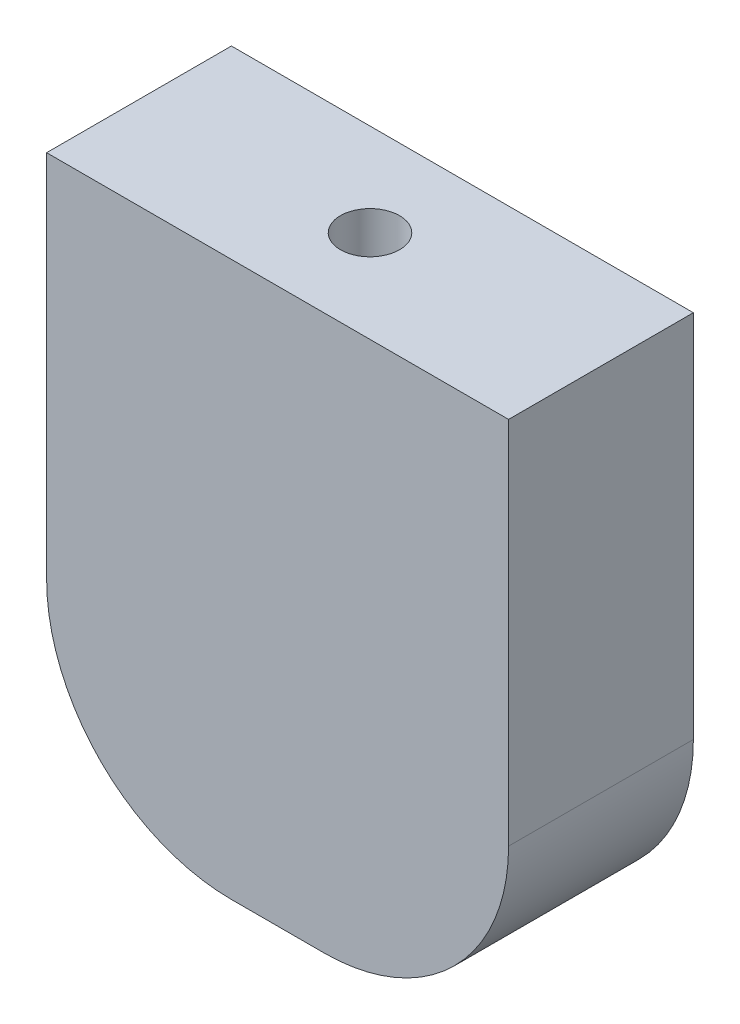
ISO-10303-21;
HEADER;
FILE_DESCRIPTION(('STEP AP214'),'2;1');
FILE_NAME('part.step','',(''),(''),'','','');
FILE_SCHEMA(('AUTOMOTIVE_DESIGN { 1 0 10303 214 1 1 1 1 }'));
ENDSEC;
DATA;
#1=APPLICATION_CONTEXT('core data for automotive mechanical design processes');
#2=APPLICATION_PROTOCOL_DEFINITION('international standard','automotive_design',2000,#1);
#3=PRODUCT_CONTEXT('',#1,'mechanical');
#4=PRODUCT('Part','Part','',(#3));
#5=PRODUCT_RELATED_PRODUCT_CATEGORY('part','',(#4));
#6=PRODUCT_DEFINITION_FORMATION('','',#4);
#7=PRODUCT_DEFINITION_CONTEXT('part definition',#1,'design');
#8=PRODUCT_DEFINITION('design','',#6,#7);
#9=PRODUCT_DEFINITION_SHAPE('','',#8);
#10=(LENGTH_UNIT() NAMED_UNIT(*) SI_UNIT(.MILLI.,.METRE.));
#11=(NAMED_UNIT(*) PLANE_ANGLE_UNIT() SI_UNIT($,.RADIAN.));
#12=(NAMED_UNIT(*) SI_UNIT($,.STERADIAN.) SOLID_ANGLE_UNIT());
#13=UNCERTAINTY_MEASURE_WITH_UNIT(LENGTH_MEASURE(1.E-05),#10,'distance_accuracy_value','');
#14=(GEOMETRIC_REPRESENTATION_CONTEXT(3) GLOBAL_UNCERTAINTY_ASSIGNED_CONTEXT((#13)) GLOBAL_UNIT_ASSIGNED_CONTEXT((#10,
#11,#12)) REPRESENTATION_CONTEXT('',''));
#15=CARTESIAN_POINT('',(0.,0.,0.));
#16=DIRECTION('',(0.,0.,1.));
#17=DIRECTION('',(1.,0.,0.));
#18=AXIS2_PLACEMENT_3D('',#15,#16,#17);
#19=CARTESIAN_POINT('',(6.35,73.6600000000001,6.35));
#20=DIRECTION('',(1.,0.,0.));
#21=DIRECTION('',(0.,1.,0.));
#22=AXIS2_PLACEMENT_3D('',#19,#20,#21);
#23=PLANE('',#22);
#24=DIRECTION('',(0.,-1.,0.));
#25=VECTOR('',#24,1.);
#26=CARTESIAN_POINT('',(6.35,73.6600000000001,-6.35));
#27=LINE('',#26,#25);
#28=CARTESIAN_POINT('',(6.35,73.6600000000001,-6.35));
#29=VERTEX_POINT('',#28);
#30=CARTESIAN_POINT('',(6.35,48.2600000000001,-6.35));
#31=VERTEX_POINT('',#30);
#32=EDGE_CURVE('E112',#29,#31,#27,.T.);
#33=ORIENTED_EDGE('',*,*,#32,.T.);
#34=DIRECTION('',(0.,0.,-1.));
#35=VECTOR('',#34,1.);
#36=CARTESIAN_POINT('',(6.35,48.2600000000001,6.35));
#37=LINE('',#36,#35);
#38=CARTESIAN_POINT('',(6.35,48.2600000000001,6.35));
#39=VERTEX_POINT('',#38);
#40=EDGE_CURVE('E11',#31,#39,#37,.F.);
#41=ORIENTED_EDGE('',*,*,#40,.T.);
#42=DIRECTION('',(0.,-1.,0.));
#43=VECTOR('',#42,1.);
#44=CARTESIAN_POINT('',(6.35,73.6600000000001,6.35));
#45=LINE('',#44,#43);
#46=CARTESIAN_POINT('',(6.35,73.6600000000001,6.35));
#47=VERTEX_POINT('',#46);
#48=EDGE_CURVE('E119',#47,#39,#45,.T.);
#49=ORIENTED_EDGE('',*,*,#48,.F.);
#50=DIRECTION('',(0.,0.,-1.));
#51=VECTOR('',#50,1.);
#52=CARTESIAN_POINT('',(6.35,73.6600000000001,6.35));
#53=LINE('',#52,#51);
#54=EDGE_CURVE('E104',#47,#29,#53,.T.);
#55=ORIENTED_EDGE('',*,*,#54,.T.);
#56=EDGE_LOOP('',(#33,#41,#49,#55));
#57=FACE_BOUND('',#56,.T.);
#58=ADVANCED_FACE('F30',(#57),#23,.F.);
#59=CARTESIAN_POINT('',(6.35,35.5600000000001,6.35));
#60=DIRECTION('',(0.,1.,0.));
#61=DIRECTION('',(0.,0.,1.));
#62=AXIS2_PLACEMENT_3D('',#59,#60,#61);
#63=PLANE('',#62);
#64=DIRECTION('',(1.,0.,0.));
#65=VECTOR('',#64,1.);
#66=CARTESIAN_POINT('',(6.35,35.5600000000001,-6.35));
#67=LINE('',#66,#65);
#68=CARTESIAN_POINT('',(19.05,35.5600000000001,-6.35));
#69=VERTEX_POINT('',#68);
#70=CARTESIAN_POINT('',(25.4,35.5600000000001,-6.35));
#71=VERTEX_POINT('',#70);
#72=EDGE_CURVE('E114',#69,#71,#67,.T.);
#73=ORIENTED_EDGE('',*,*,#72,.T.);
#74=DIRECTION('',(0.,0.,-1.));
#75=VECTOR('',#74,1.);
#76=CARTESIAN_POINT('',(25.4,35.5600000000001,6.35));
#77=LINE('',#76,#75);
#78=CARTESIAN_POINT('',(25.4,35.5600000000001,6.35));
#79=VERTEX_POINT('',#78);
#80=EDGE_CURVE('E51',#71,#79,#77,.F.);
#81=ORIENTED_EDGE('',*,*,#80,.T.);
#82=DIRECTION('',(1.,0.,0.));
#83=VECTOR('',#82,1.);
#84=CARTESIAN_POINT('',(6.35,35.5600000000001,6.35));
#85=LINE('',#84,#83);
#86=CARTESIAN_POINT('',(19.05,35.5600000000001,6.35));
#87=VERTEX_POINT('',#86);
#88=EDGE_CURVE('E94',#87,#79,#85,.T.);
#89=ORIENTED_EDGE('',*,*,#88,.F.);
#90=DIRECTION('',(0.,0.,-1.));
#91=VECTOR('',#90,1.);
#92=CARTESIAN_POINT('',(19.05,35.5600000000001,6.35));
#93=LINE('',#92,#91);
#94=EDGE_CURVE('E126',#87,#69,#93,.T.);
#95=ORIENTED_EDGE('',*,*,#94,.T.);
#96=EDGE_LOOP('',(#73,#81,#89,#95));
#97=FACE_BOUND('',#96,.T.);
#98=ADVANCED_FACE('F134',(#97),#63,.F.);
#99=CARTESIAN_POINT('',(38.1,73.6600000000001,6.35));
#100=DIRECTION('',(-1.,0.,0.));
#101=DIRECTION('',(0.,0.,1.));
#102=AXIS2_PLACEMENT_3D('',#99,#100,#101);
#103=PLANE('',#102);
#104=DIRECTION('',(0.,1.,0.));
#105=VECTOR('',#104,1.);
#106=CARTESIAN_POINT('',(38.1,73.6600000000001,6.35));
#107=LINE('',#106,#105);
#108=CARTESIAN_POINT('',(38.1,48.2600000000001,6.35));
#109=VERTEX_POINT('',#108);
#110=CARTESIAN_POINT('',(38.1,73.6600000000001,6.35));
#111=VERTEX_POINT('',#110);
#112=EDGE_CURVE('E84',#109,#111,#107,.T.);
#113=ORIENTED_EDGE('',*,*,#112,.F.);
#114=DIRECTION('',(0.,0.,-1.));
#115=VECTOR('',#114,1.);
#116=CARTESIAN_POINT('',(38.1,48.2600000000001,6.35));
#117=LINE('',#116,#115);
#118=CARTESIAN_POINT('',(38.1,48.2600000000001,-6.35));
#119=VERTEX_POINT('',#118);
#120=EDGE_CURVE('E103',#109,#119,#117,.T.);
#121=ORIENTED_EDGE('',*,*,#120,.T.);
#122=DIRECTION('',(0.,1.,0.));
#123=VECTOR('',#122,1.);
#124=CARTESIAN_POINT('',(38.1,73.6600000000001,-6.35));
#125=LINE('',#124,#123);
#126=CARTESIAN_POINT('',(38.1,73.6600000000001,-6.35));
#127=VERTEX_POINT('',#126);
#128=EDGE_CURVE('E100',#119,#127,#125,.T.);
#129=ORIENTED_EDGE('',*,*,#128,.T.);
#130=DIRECTION('',(0.,0.,-1.));
#131=VECTOR('',#130,1.);
#132=CARTESIAN_POINT('',(38.1,73.6600000000001,6.35));
#133=LINE('',#132,#131);
#134=EDGE_CURVE('E97',#111,#127,#133,.T.);
#135=ORIENTED_EDGE('',*,*,#134,.F.);
#136=EDGE_LOOP('',(#113,#121,#129,#135));
#137=FACE_BOUND('',#136,.T.);
#138=ADVANCED_FACE('F98',(#137),#103,.F.);
#139=CARTESIAN_POINT('',(6.35,73.6600000000001,6.35));
#140=DIRECTION('',(0.,-1.,0.));
#141=DIRECTION('',(0.,0.,-1.));
#142=AXIS2_PLACEMENT_3D('',#139,#140,#141);
#143=PLANE('',#142);
#144=CARTESIAN_POINT('',(22.225,73.6600000000001,0.));
#145=DIRECTION('',(0.,1.,0.));
#146=DIRECTION('',(0.,0.,1.));
#147=AXIS2_PLACEMENT_3D('',#144,#145,#146);
#148=CIRCLE('',#147,2.032);
#149=CARTESIAN_POINT('',(22.225,73.6600000000001,2.032));
#150=VERTEX_POINT('',#149);
#151=EDGE_CURVE('E141',#150,#150,#148,.T.);
#152=ORIENTED_EDGE('',*,*,#151,.F.);
#153=EDGE_LOOP('',(#152));
#154=FACE_BOUND('',#153,.T.);
#155=DIRECTION('',(-1.,0.,0.));
#156=VECTOR('',#155,1.);
#157=CARTESIAN_POINT('',(6.35,73.6600000000001,-6.35));
#158=LINE('',#157,#156);
#159=EDGE_CURVE('E118',#127,#29,#158,.T.);
#160=ORIENTED_EDGE('',*,*,#159,.T.);
#161=ORIENTED_EDGE('',*,*,#54,.F.);
#162=DIRECTION('',(-1.,0.,0.));
#163=VECTOR('',#162,1.);
#164=CARTESIAN_POINT('',(6.35,73.6600000000001,6.35));
#165=LINE('',#164,#163);
#166=EDGE_CURVE('E88',#111,#47,#165,.T.);
#167=ORIENTED_EDGE('',*,*,#166,.F.);
#168=ORIENTED_EDGE('',*,*,#134,.T.);
#169=EDGE_LOOP('',(#160,#161,#167,#168));
#170=FACE_BOUND('',#169,.T.);
#171=ADVANCED_FACE('F106',(#154,#170),#143,.F.);
#172=CARTESIAN_POINT('',(6.35,35.5600000000001,6.35));
#173=DIRECTION('',(0.,0.,1.));
#174=DIRECTION('',(1.,0.,0.));
#175=AXIS2_PLACEMENT_3D('',#172,#173,#174);
#176=PLANE('',#175);
#177=ORIENTED_EDGE('',*,*,#88,.T.);
#178=CARTESIAN_POINT('',(25.4,48.2600000000001,6.35));
#179=DIRECTION('',(0.,0.,1.));
#180=DIRECTION('',(1.,0.,0.));
#181=AXIS2_PLACEMENT_3D('',#178,#179,#180);
#182=CIRCLE('',#181,12.7);
#183=EDGE_CURVE('E38',#79,#109,#182,.T.);
#184=ORIENTED_EDGE('',*,*,#183,.T.);
#185=ORIENTED_EDGE('',*,*,#112,.T.);
#186=ORIENTED_EDGE('',*,*,#166,.T.);
#187=ORIENTED_EDGE('',*,*,#48,.T.);
#188=CARTESIAN_POINT('',(19.05,48.2600000000001,6.35));
#189=DIRECTION('',(0.,0.,1.));
#190=DIRECTION('',(1.,0.,0.));
#191=AXIS2_PLACEMENT_3D('',#188,#189,#190);
#192=CIRCLE('',#191,12.7);
#193=EDGE_CURVE('E130',#39,#87,#192,.T.);
#194=ORIENTED_EDGE('',*,*,#193,.T.);
#195=EDGE_LOOP('',(#177,#184,#185,#186,#187,#194));
#196=FACE_BOUND('',#195,.T.);
#197=ADVANCED_FACE('F86',(#196),#176,.T.);
#198=CARTESIAN_POINT('',(6.35,35.5600000000001,-6.35));
#199=DIRECTION('',(0.,0.,1.));
#200=DIRECTION('',(1.,0.,0.));
#201=AXIS2_PLACEMENT_3D('',#198,#199,#200);
#202=PLANE('',#201);
#203=ORIENTED_EDGE('',*,*,#128,.F.);
#204=CARTESIAN_POINT('',(25.4,48.2600000000001,-6.35));
#205=DIRECTION('',(0.,0.,1.));
#206=DIRECTION('',(1.,0.,0.));
#207=AXIS2_PLACEMENT_3D('',#204,#205,#206);
#208=CIRCLE('',#207,12.7);
#209=EDGE_CURVE('E124',#119,#71,#208,.F.);
#210=ORIENTED_EDGE('',*,*,#209,.T.);
#211=ORIENTED_EDGE('',*,*,#72,.F.);
#212=CARTESIAN_POINT('',(19.05,48.2600000000001,-6.35));
#213=DIRECTION('',(0.,0.,1.));
#214=DIRECTION('',(1.,0.,0.));
#215=AXIS2_PLACEMENT_3D('',#212,#213,#214);
#216=CIRCLE('',#215,12.7);
#217=EDGE_CURVE('E122',#69,#31,#216,.F.);
#218=ORIENTED_EDGE('',*,*,#217,.T.);
#219=ORIENTED_EDGE('',*,*,#32,.F.);
#220=ORIENTED_EDGE('',*,*,#159,.F.);
#221=EDGE_LOOP('',(#203,#210,#211,#218,#219,#220));
#222=FACE_BOUND('',#221,.T.);
#223=ADVANCED_FACE('F138',(#222),#202,.F.);
#224=CARTESIAN_POINT('',(25.4,48.2600000000001,6.35));
#225=DIRECTION('',(0.,0.,-1.));
#226=DIRECTION('',(-1.,0.,0.));
#227=AXIS2_PLACEMENT_3D('',#224,#225,#226);
#228=CYLINDRICAL_SURFACE('',#227,12.7);
#229=ORIENTED_EDGE('',*,*,#183,.F.);
#230=ORIENTED_EDGE('',*,*,#80,.F.);
#231=ORIENTED_EDGE('',*,*,#209,.F.);
#232=ORIENTED_EDGE('',*,*,#120,.F.);
#233=EDGE_LOOP('',(#229,#230,#231,#232));
#234=FACE_BOUND('',#233,.T.);
#235=ADVANCED_FACE('F170',(#234),#228,.T.);
#236=CARTESIAN_POINT('',(19.05,48.2600000000001,6.35));
#237=DIRECTION('',(0.,0.,-1.));
#238=DIRECTION('',(-1.,0.,0.));
#239=AXIS2_PLACEMENT_3D('',#236,#237,#238);
#240=CYLINDRICAL_SURFACE('',#239,12.7);
#241=ORIENTED_EDGE('',*,*,#193,.F.);
#242=ORIENTED_EDGE('',*,*,#40,.F.);
#243=ORIENTED_EDGE('',*,*,#217,.F.);
#244=ORIENTED_EDGE('',*,*,#94,.F.);
#245=EDGE_LOOP('',(#241,#242,#243,#244));
#246=FACE_BOUND('',#245,.T.);
#247=ADVANCED_FACE('F32',(#246),#240,.T.);
#248=CARTESIAN_POINT('',(22.225,60.9600000000001,0.));
#249=DIRECTION('',(0.,1.,0.));
#250=DIRECTION('',(0.,0.,1.));
#251=AXIS2_PLACEMENT_3D('',#248,#249,#250);
#252=CYLINDRICAL_SURFACE('',#251,2.032);
#253=CARTESIAN_POINT('',(22.225,60.9600000000001,0.));
#254=DIRECTION('',(0.,1.,0.));
#255=DIRECTION('',(0.,0.,1.));
#256=AXIS2_PLACEMENT_3D('',#253,#254,#255);
#257=CIRCLE('',#256,2.032);
#258=CARTESIAN_POINT('',(22.225,60.9600000000001,2.032));
#259=VERTEX_POINT('',#258);
#260=EDGE_CURVE('E115',#259,#259,#257,.T.);
#261=ORIENTED_EDGE('',*,*,#260,.F.);
#262=EDGE_LOOP('',(#261));
#263=FACE_BOUND('',#262,.T.);
#264=ORIENTED_EDGE('',*,*,#151,.T.);
#265=EDGE_LOOP('',(#264));
#266=FACE_BOUND('',#265,.T.);
#267=ADVANCED_FACE('F149',(#263,#266),#252,.F.);
#268=CARTESIAN_POINT('',(22.225,60.9600000000001,0.));
#269=DIRECTION('',(0.,1.,0.));
#270=DIRECTION('',(0.,0.,1.));
#271=AXIS2_PLACEMENT_3D('',#268,#269,#270);
#272=PLANE('',#271);
#273=ORIENTED_EDGE('',*,*,#260,.T.);
#274=EDGE_LOOP('',(#273));
#275=FACE_BOUND('',#274,.T.);
#276=ADVANCED_FACE('F147',(#275),#272,.T.);
#277=CLOSED_SHELL('',(#58,#98,#138,#171,#197,#223,#235,#247,#267,#276));
#278=MANIFOLD_SOLID_BREP('B2',#277);
#279=ADVANCED_BREP_SHAPE_REPRESENTATION('',(#18,#278),#14);
#280=SHAPE_DEFINITION_REPRESENTATION(#9,#279);
ENDSEC;
END-ISO-10303-21;
